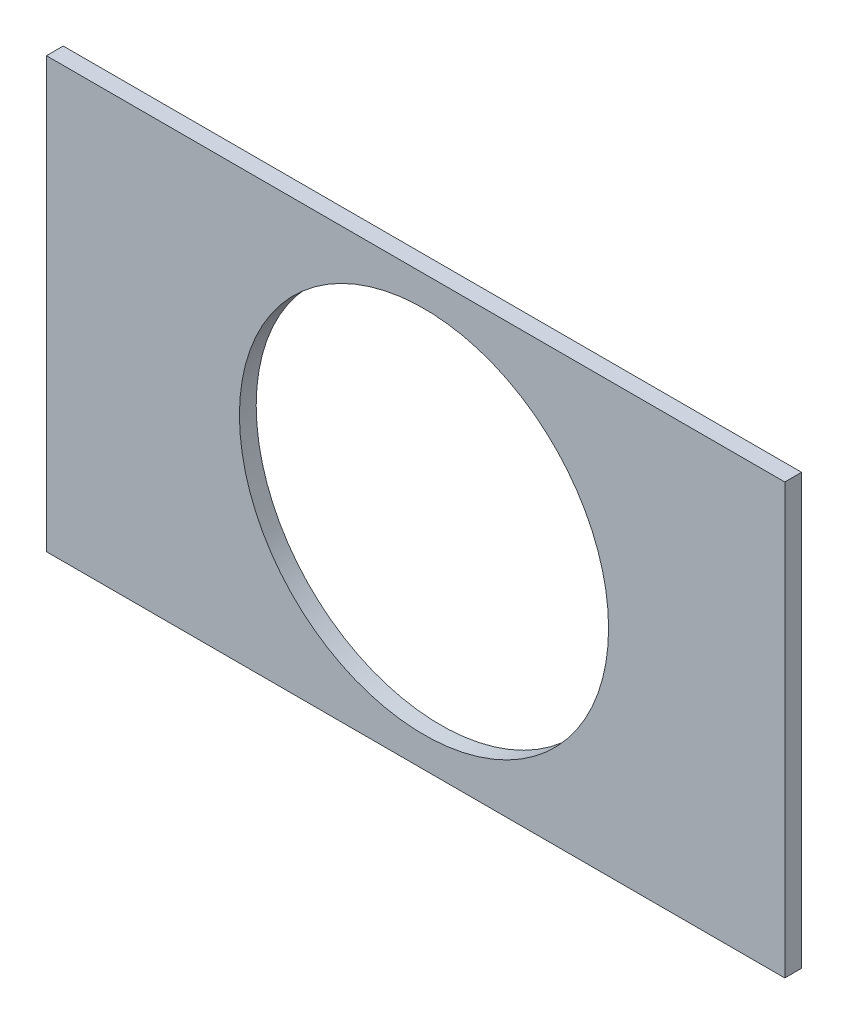
ISO-10303-21;
HEADER;
FILE_DESCRIPTION(('STEP AP214'),'2;1');
FILE_NAME('part.step','',(''),(''),'','','');
FILE_SCHEMA(('AUTOMOTIVE_DESIGN { 1 0 10303 214 1 1 1 1 }'));
ENDSEC;
DATA;
#1=APPLICATION_CONTEXT('core data for automotive mechanical design processes');
#2=APPLICATION_PROTOCOL_DEFINITION('international standard','automotive_design',2000,#1);
#3=PRODUCT_CONTEXT('',#1,'mechanical');
#4=PRODUCT('Part','Part','',(#3));
#5=PRODUCT_RELATED_PRODUCT_CATEGORY('part','',(#4));
#6=PRODUCT_DEFINITION_FORMATION('','',#4);
#7=PRODUCT_DEFINITION_CONTEXT('part definition',#1,'design');
#8=PRODUCT_DEFINITION('design','',#6,#7);
#9=PRODUCT_DEFINITION_SHAPE('','',#8);
#10=(LENGTH_UNIT() NAMED_UNIT(*) SI_UNIT(.MILLI.,.METRE.));
#11=(NAMED_UNIT(*) PLANE_ANGLE_UNIT() SI_UNIT($,.RADIAN.));
#12=(NAMED_UNIT(*) SI_UNIT($,.STERADIAN.) SOLID_ANGLE_UNIT());
#13=UNCERTAINTY_MEASURE_WITH_UNIT(LENGTH_MEASURE(1.E-05),#10,'distance_accuracy_value','');
#14=(GEOMETRIC_REPRESENTATION_CONTEXT(3) GLOBAL_UNCERTAINTY_ASSIGNED_CONTEXT((#13)) GLOBAL_UNIT_ASSIGNED_CONTEXT((#10,
#11,#12)) REPRESENTATION_CONTEXT('',''));
#15=CARTESIAN_POINT('',(0.,0.,0.));
#16=DIRECTION('',(0.,0.,1.));
#17=DIRECTION('',(1.,0.,0.));
#18=AXIS2_PLACEMENT_3D('',#15,#16,#17);
#19=CARTESIAN_POINT('',(0.,0.,6.35));
#20=DIRECTION('',(0.,0.,1.));
#21=DIRECTION('',(1.,0.,0.));
#22=AXIS2_PLACEMENT_3D('',#19,#20,#21);
#23=PLANE('',#22);
#24=DIRECTION('',(0.,-1.,0.));
#25=VECTOR('',#24,1.);
#26=CARTESIAN_POINT('',(0.,0.,6.35));
#27=LINE('',#26,#25);
#28=CARTESIAN_POINT('',(0.,0.,6.35));
#29=VERTEX_POINT('',#28);
#30=CARTESIAN_POINT('',(0.,-162.56,6.35));
#31=VERTEX_POINT('',#30);
#32=EDGE_CURVE('E85',#29,#31,#27,.T.);
#33=ORIENTED_EDGE('',*,*,#32,.T.);
#34=DIRECTION('',(1.,0.,0.));
#35=VECTOR('',#34,1.);
#36=CARTESIAN_POINT('',(0.,-162.56,6.35));
#37=LINE('',#36,#35);
#38=CARTESIAN_POINT('',(279.4,-162.56,6.35));
#39=VERTEX_POINT('',#38);
#40=EDGE_CURVE('E80',#31,#39,#37,.T.);
#41=ORIENTED_EDGE('',*,*,#40,.T.);
#42=DIRECTION('',(0.,1.,0.));
#43=VECTOR('',#42,1.);
#44=CARTESIAN_POINT('',(279.4,0.,6.35));
#45=LINE('',#44,#43);
#46=CARTESIAN_POINT('',(279.4,0.,6.35));
#47=VERTEX_POINT('',#46);
#48=EDGE_CURVE('E83',#39,#47,#45,.T.);
#49=ORIENTED_EDGE('',*,*,#48,.T.);
#50=DIRECTION('',(-1.,0.,0.));
#51=VECTOR('',#50,1.);
#52=CARTESIAN_POINT('',(0.,0.,6.35));
#53=LINE('',#52,#51);
#54=EDGE_CURVE('E50',#47,#29,#53,.T.);
#55=ORIENTED_EDGE('',*,*,#54,.T.);
#56=EDGE_LOOP('',(#33,#41,#49,#55));
#57=FACE_BOUND('',#56,.T.);
#58=CARTESIAN_POINT('',(142.875,-81.28,6.35));
#59=DIRECTION('',(0.,0.,1.));
#60=DIRECTION('',(1.,0.,0.));
#61=AXIS2_PLACEMENT_3D('',#58,#59,#60);
#62=CIRCLE('',#61,69.85);
#63=CARTESIAN_POINT('',(212.725,-81.28,6.35));
#64=VERTEX_POINT('',#63);
#65=EDGE_CURVE('E100',#64,#64,#62,.T.);
#66=ORIENTED_EDGE('',*,*,#65,.F.);
#67=EDGE_LOOP('',(#66));
#68=FACE_BOUND('',#67,.T.);
#69=ADVANCED_FACE('F33',(#57,#68),#23,.T.);
#70=CARTESIAN_POINT('',(0.,0.,0.));
#71=DIRECTION('',(0.,0.,1.));
#72=DIRECTION('',(1.,0.,0.));
#73=AXIS2_PLACEMENT_3D('',#70,#71,#72);
#74=PLANE('',#73);
#75=DIRECTION('',(0.,-1.,0.));
#76=VECTOR('',#75,1.);
#77=CARTESIAN_POINT('',(0.,0.,0.));
#78=LINE('',#77,#76);
#79=CARTESIAN_POINT('',(0.,0.,0.));
#80=VERTEX_POINT('',#79);
#81=CARTESIAN_POINT('',(0.,-162.56,0.));
#82=VERTEX_POINT('',#81);
#83=EDGE_CURVE('E97',#80,#82,#78,.T.);
#84=ORIENTED_EDGE('',*,*,#83,.F.);
#85=DIRECTION('',(-1.,0.,0.));
#86=VECTOR('',#85,1.);
#87=CARTESIAN_POINT('',(0.,0.,0.));
#88=LINE('',#87,#86);
#89=CARTESIAN_POINT('',(279.4,0.,0.));
#90=VERTEX_POINT('',#89);
#91=EDGE_CURVE('E73',#90,#80,#88,.T.);
#92=ORIENTED_EDGE('',*,*,#91,.F.);
#93=DIRECTION('',(0.,1.,0.));
#94=VECTOR('',#93,1.);
#95=CARTESIAN_POINT('',(279.4,0.,0.));
#96=LINE('',#95,#94);
#97=CARTESIAN_POINT('',(279.4,-162.56,0.));
#98=VERTEX_POINT('',#97);
#99=EDGE_CURVE('E67',#98,#90,#96,.T.);
#100=ORIENTED_EDGE('',*,*,#99,.F.);
#101=DIRECTION('',(1.,0.,0.));
#102=VECTOR('',#101,1.);
#103=CARTESIAN_POINT('',(0.,-162.56,0.));
#104=LINE('',#103,#102);
#105=EDGE_CURVE('E89',#82,#98,#104,.T.);
#106=ORIENTED_EDGE('',*,*,#105,.F.);
#107=EDGE_LOOP('',(#84,#92,#100,#106));
#108=FACE_BOUND('',#107,.T.);
#109=CARTESIAN_POINT('',(142.875,-81.28,0.));
#110=DIRECTION('',(0.,0.,1.));
#111=DIRECTION('',(1.,0.,0.));
#112=AXIS2_PLACEMENT_3D('',#109,#110,#111);
#113=CIRCLE('',#112,69.85);
#114=CARTESIAN_POINT('',(212.725,-81.28,0.));
#115=VERTEX_POINT('',#114);
#116=EDGE_CURVE('E112',#115,#115,#113,.T.);
#117=ORIENTED_EDGE('',*,*,#116,.T.);
#118=EDGE_LOOP('',(#117));
#119=FACE_BOUND('',#118,.T.);
#120=ADVANCED_FACE('F108',(#108,#119),#74,.F.);
#121=CARTESIAN_POINT('',(0.,0.,6.35));
#122=DIRECTION('',(1.,0.,0.));
#123=DIRECTION('',(0.,1.,0.));
#124=AXIS2_PLACEMENT_3D('',#121,#122,#123);
#125=PLANE('',#124);
#126=ORIENTED_EDGE('',*,*,#83,.T.);
#127=DIRECTION('',(0.,0.,-1.));
#128=VECTOR('',#127,1.);
#129=CARTESIAN_POINT('',(0.,-162.56,6.35));
#130=LINE('',#129,#128);
#131=EDGE_CURVE('E11',#31,#82,#130,.T.);
#132=ORIENTED_EDGE('',*,*,#131,.F.);
#133=ORIENTED_EDGE('',*,*,#32,.F.);
#134=DIRECTION('',(0.,0.,-1.));
#135=VECTOR('',#134,1.);
#136=CARTESIAN_POINT('',(0.,0.,6.35));
#137=LINE('',#136,#135);
#138=EDGE_CURVE('E93',#29,#80,#137,.T.);
#139=ORIENTED_EDGE('',*,*,#138,.T.);
#140=EDGE_LOOP('',(#126,#132,#133,#139));
#141=FACE_BOUND('',#140,.T.);
#142=ADVANCED_FACE('F35',(#141),#125,.F.);
#143=CARTESIAN_POINT('',(0.,-162.56,6.35));
#144=DIRECTION('',(0.,1.,0.));
#145=DIRECTION('',(0.,0.,1.));
#146=AXIS2_PLACEMENT_3D('',#143,#144,#145);
#147=PLANE('',#146);
#148=ORIENTED_EDGE('',*,*,#105,.T.);
#149=DIRECTION('',(0.,0.,-1.));
#150=VECTOR('',#149,1.);
#151=CARTESIAN_POINT('',(279.4,-162.56,6.35));
#152=LINE('',#151,#150);
#153=EDGE_CURVE('E42',#39,#98,#152,.T.);
#154=ORIENTED_EDGE('',*,*,#153,.F.);
#155=ORIENTED_EDGE('',*,*,#40,.F.);
#156=ORIENTED_EDGE('',*,*,#131,.T.);
#157=EDGE_LOOP('',(#148,#154,#155,#156));
#158=FACE_BOUND('',#157,.T.);
#159=ADVANCED_FACE('F88',(#158),#147,.F.);
#160=CARTESIAN_POINT('',(279.4,0.,6.35));
#161=DIRECTION('',(-1.,0.,0.));
#162=DIRECTION('',(0.,0.,1.));
#163=AXIS2_PLACEMENT_3D('',#160,#161,#162);
#164=PLANE('',#163);
#165=ORIENTED_EDGE('',*,*,#99,.T.);
#166=DIRECTION('',(0.,0.,-1.));
#167=VECTOR('',#166,1.);
#168=CARTESIAN_POINT('',(279.4,0.,6.35));
#169=LINE('',#168,#167);
#170=EDGE_CURVE('E90',#47,#90,#169,.T.);
#171=ORIENTED_EDGE('',*,*,#170,.F.);
#172=ORIENTED_EDGE('',*,*,#48,.F.);
#173=ORIENTED_EDGE('',*,*,#153,.T.);
#174=EDGE_LOOP('',(#165,#171,#172,#173));
#175=FACE_BOUND('',#174,.T.);
#176=ADVANCED_FACE('F91',(#175),#164,.F.);
#177=CARTESIAN_POINT('',(0.,0.,6.35));
#178=DIRECTION('',(0.,-1.,0.));
#179=DIRECTION('',(0.,0.,-1.));
#180=AXIS2_PLACEMENT_3D('',#177,#178,#179);
#181=PLANE('',#180);
#182=ORIENTED_EDGE('',*,*,#91,.T.);
#183=ORIENTED_EDGE('',*,*,#138,.F.);
#184=ORIENTED_EDGE('',*,*,#54,.F.);
#185=ORIENTED_EDGE('',*,*,#170,.T.);
#186=EDGE_LOOP('',(#182,#183,#184,#185));
#187=FACE_BOUND('',#186,.T.);
#188=ADVANCED_FACE('F105',(#187),#181,.F.);
#189=CARTESIAN_POINT('',(142.875,-81.28,6.35));
#190=DIRECTION('',(0.,0.,-1.));
#191=DIRECTION('',(-1.,0.,0.));
#192=AXIS2_PLACEMENT_3D('',#189,#190,#191);
#193=CYLINDRICAL_SURFACE('',#192,69.85);
#194=ORIENTED_EDGE('',*,*,#65,.T.);
#195=EDGE_LOOP('',(#194));
#196=FACE_BOUND('',#195,.T.);
#197=ORIENTED_EDGE('',*,*,#116,.F.);
#198=EDGE_LOOP('',(#197));
#199=FACE_BOUND('',#198,.T.);
#200=ADVANCED_FACE('F118',(#196,#199),#193,.F.);
#201=CLOSED_SHELL('',(#69,#120,#142,#159,#176,#188,#200));
#202=MANIFOLD_SOLID_BREP('B2',#201);
#203=ADVANCED_BREP_SHAPE_REPRESENTATION('',(#18,#202),#14);
#204=SHAPE_DEFINITION_REPRESENTATION(#9,#203);
ENDSEC;
END-ISO-10303-21;
